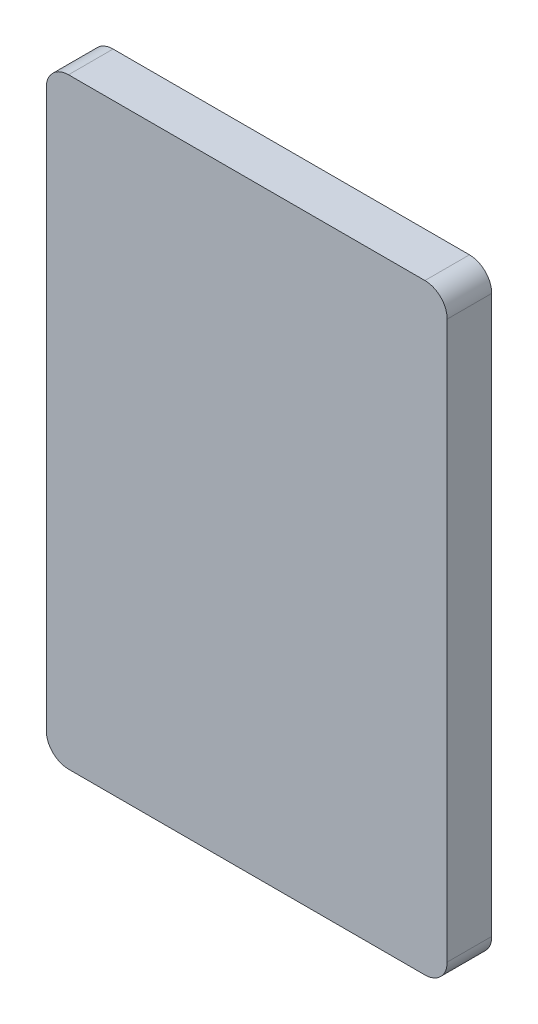
ISO-10303-21;
HEADER;
FILE_DESCRIPTION(('STEP AP214'),'2;1');
FILE_NAME('part.step','',(''),(''),'','','');
FILE_SCHEMA(('AUTOMOTIVE_DESIGN { 1 0 10303 214 1 1 1 1 }'));
ENDSEC;
DATA;
#1=APPLICATION_CONTEXT('core data for automotive mechanical design processes');
#2=APPLICATION_PROTOCOL_DEFINITION('international standard','automotive_design',2000,#1);
#3=PRODUCT_CONTEXT('',#1,'mechanical');
#4=PRODUCT('Part','Part','',(#3));
#5=PRODUCT_RELATED_PRODUCT_CATEGORY('part','',(#4));
#6=PRODUCT_DEFINITION_FORMATION('','',#4);
#7=PRODUCT_DEFINITION_CONTEXT('part definition',#1,'design');
#8=PRODUCT_DEFINITION('design','',#6,#7);
#9=PRODUCT_DEFINITION_SHAPE('','',#8);
#10=(LENGTH_UNIT() NAMED_UNIT(*) SI_UNIT(.MILLI.,.METRE.));
#11=(NAMED_UNIT(*) PLANE_ANGLE_UNIT() SI_UNIT($,.RADIAN.));
#12=(NAMED_UNIT(*) SI_UNIT($,.STERADIAN.) SOLID_ANGLE_UNIT());
#13=UNCERTAINTY_MEASURE_WITH_UNIT(LENGTH_MEASURE(1.E-05),#10,'distance_accuracy_value','');
#14=(GEOMETRIC_REPRESENTATION_CONTEXT(3) GLOBAL_UNCERTAINTY_ASSIGNED_CONTEXT((#13)) GLOBAL_UNIT_ASSIGNED_CONTEXT((#10,
#11,#12)) REPRESENTATION_CONTEXT('',''));
#15=CARTESIAN_POINT('',(0.,0.,0.));
#16=DIRECTION('',(0.,0.,1.));
#17=DIRECTION('',(1.,0.,0.));
#18=AXIS2_PLACEMENT_3D('',#15,#16,#17);
#19=CARTESIAN_POINT('',(-9.,-13.5,2.));
#20=DIRECTION('',(1.,0.,0.));
#21=DIRECTION('',(0.,0.,-1.));
#22=AXIS2_PLACEMENT_3D('',#19,#20,#21);
#23=PLANE('',#22);
#24=DIRECTION('',(0.,-1.,0.));
#25=VECTOR('',#24,1.);
#26=CARTESIAN_POINT('',(-9.,-13.5,0.));
#27=LINE('',#26,#25);
#28=CARTESIAN_POINT('',(-9.,12.5,0.));
#29=VERTEX_POINT('',#28);
#30=CARTESIAN_POINT('',(-9.,-12.5,0.));
#31=VERTEX_POINT('',#30);
#32=EDGE_CURVE('E171',#29,#31,#27,.T.);
#33=ORIENTED_EDGE('',*,*,#32,.T.);
#34=DIRECTION('',(0.,0.,-1.));
#35=VECTOR('',#34,1.);
#36=CARTESIAN_POINT('',(-9.,-12.5,2.));
#37=LINE('',#36,#35);
#38=CARTESIAN_POINT('',(-9.,-12.5,2.));
#39=VERTEX_POINT('',#38);
#40=EDGE_CURVE('E13',#31,#39,#37,.F.);
#41=ORIENTED_EDGE('',*,*,#40,.T.);
#42=DIRECTION('',(0.,-1.,0.));
#43=VECTOR('',#42,1.);
#44=CARTESIAN_POINT('',(-9.,-13.5,2.));
#45=LINE('',#44,#43);
#46=CARTESIAN_POINT('',(-9.,12.5,2.));
#47=VERTEX_POINT('',#46);
#48=EDGE_CURVE('E139',#47,#39,#45,.T.);
#49=ORIENTED_EDGE('',*,*,#48,.F.);
#50=DIRECTION('',(0.,0.,-1.));
#51=VECTOR('',#50,1.);
#52=CARTESIAN_POINT('',(-9.,12.5,2.));
#53=LINE('',#52,#51);
#54=EDGE_CURVE('E55',#47,#29,#53,.T.);
#55=ORIENTED_EDGE('',*,*,#54,.T.);
#56=EDGE_LOOP('',(#33,#41,#49,#55));
#57=FACE_BOUND('',#56,.T.);
#58=ADVANCED_FACE('F47',(#57),#23,.F.);
#59=CARTESIAN_POINT('',(9.,-13.5,2.));
#60=DIRECTION('',(0.,1.,0.));
#61=DIRECTION('',(-1.,0.,0.));
#62=AXIS2_PLACEMENT_3D('',#59,#60,#61);
#63=PLANE('',#62);
#64=DIRECTION('',(1.,0.,0.));
#65=VECTOR('',#64,1.);
#66=CARTESIAN_POINT('',(9.,-13.5,0.));
#67=LINE('',#66,#65);
#68=CARTESIAN_POINT('',(-8.,-13.5,0.));
#69=VERTEX_POINT('',#68);
#70=CARTESIAN_POINT('',(8.,-13.5,0.));
#71=VERTEX_POINT('',#70);
#72=EDGE_CURVE('E144',#69,#71,#67,.T.);
#73=ORIENTED_EDGE('',*,*,#72,.T.);
#74=DIRECTION('',(0.,0.,-1.));
#75=VECTOR('',#74,1.);
#76=CARTESIAN_POINT('',(8.,-13.5,2.));
#77=LINE('',#76,#75);
#78=CARTESIAN_POINT('',(8.,-13.5,2.));
#79=VERTEX_POINT('',#78);
#80=EDGE_CURVE('E62',#71,#79,#77,.F.);
#81=ORIENTED_EDGE('',*,*,#80,.T.);
#82=DIRECTION('',(1.,0.,0.));
#83=VECTOR('',#82,1.);
#84=CARTESIAN_POINT('',(9.,-13.5,2.));
#85=LINE('',#84,#83);
#86=CARTESIAN_POINT('',(-8.,-13.5,2.));
#87=VERTEX_POINT('',#86);
#88=EDGE_CURVE('E142',#87,#79,#85,.T.);
#89=ORIENTED_EDGE('',*,*,#88,.F.);
#90=DIRECTION('',(0.,0.,-1.));
#91=VECTOR('',#90,1.);
#92=CARTESIAN_POINT('',(-8.,-13.5,2.));
#93=LINE('',#92,#91);
#94=EDGE_CURVE('E163',#87,#69,#93,.T.);
#95=ORIENTED_EDGE('',*,*,#94,.T.);
#96=EDGE_LOOP('',(#73,#81,#89,#95));
#97=FACE_BOUND('',#96,.T.);
#98=ADVANCED_FACE('F191',(#97),#63,.F.);
#99=CARTESIAN_POINT('',(9.,-13.5,2.));
#100=DIRECTION('',(-1.,0.,0.));
#101=DIRECTION('',(0.,0.,1.));
#102=AXIS2_PLACEMENT_3D('',#99,#100,#101);
#103=PLANE('',#102);
#104=DIRECTION('',(0.,1.,0.));
#105=VECTOR('',#104,1.);
#106=CARTESIAN_POINT('',(9.,-13.5,0.));
#107=LINE('',#106,#105);
#108=CARTESIAN_POINT('',(9.,-12.5,0.));
#109=VERTEX_POINT('',#108);
#110=CARTESIAN_POINT('',(9.,12.5,0.));
#111=VERTEX_POINT('',#110);
#112=EDGE_CURVE('E140',#109,#111,#107,.T.);
#113=ORIENTED_EDGE('',*,*,#112,.T.);
#114=DIRECTION('',(0.,0.,-1.));
#115=VECTOR('',#114,1.);
#116=CARTESIAN_POINT('',(9.,12.5,2.));
#117=LINE('',#116,#115);
#118=CARTESIAN_POINT('',(9.,12.5,2.));
#119=VERTEX_POINT('',#118);
#120=EDGE_CURVE('E118',#111,#119,#117,.F.);
#121=ORIENTED_EDGE('',*,*,#120,.T.);
#122=DIRECTION('',(0.,1.,0.));
#123=VECTOR('',#122,1.);
#124=CARTESIAN_POINT('',(9.,-13.5,2.));
#125=LINE('',#124,#123);
#126=CARTESIAN_POINT('',(9.,-12.5,2.));
#127=VERTEX_POINT('',#126);
#128=EDGE_CURVE('E179',#127,#119,#125,.T.);
#129=ORIENTED_EDGE('',*,*,#128,.F.);
#130=DIRECTION('',(0.,0.,-1.));
#131=VECTOR('',#130,1.);
#132=CARTESIAN_POINT('',(9.,-12.5,2.));
#133=LINE('',#132,#131);
#134=EDGE_CURVE('E123',#127,#109,#133,.T.);
#135=ORIENTED_EDGE('',*,*,#134,.T.);
#136=EDGE_LOOP('',(#113,#121,#129,#135));
#137=FACE_BOUND('',#136,.T.);
#138=ADVANCED_FACE('F190',(#137),#103,.F.);
#139=CARTESIAN_POINT('',(9.,13.5,2.));
#140=DIRECTION('',(0.,-1.,0.));
#141=DIRECTION('',(1.,0.,0.));
#142=AXIS2_PLACEMENT_3D('',#139,#140,#141);
#143=PLANE('',#142);
#144=DIRECTION('',(-1.,0.,0.));
#145=VECTOR('',#144,1.);
#146=CARTESIAN_POINT('',(9.,13.5,2.));
#147=LINE('',#146,#145);
#148=CARTESIAN_POINT('',(8.,13.5,2.));
#149=VERTEX_POINT('',#148);
#150=CARTESIAN_POINT('',(-8.,13.5,2.));
#151=VERTEX_POINT('',#150);
#152=EDGE_CURVE('E133',#149,#151,#147,.T.);
#153=ORIENTED_EDGE('',*,*,#152,.F.);
#154=DIRECTION('',(0.,0.,-1.));
#155=VECTOR('',#154,1.);
#156=CARTESIAN_POINT('',(8.,13.5,2.));
#157=LINE('',#156,#155);
#158=CARTESIAN_POINT('',(8.,13.5,0.));
#159=VERTEX_POINT('',#158);
#160=EDGE_CURVE('E117',#149,#159,#157,.T.);
#161=ORIENTED_EDGE('',*,*,#160,.T.);
#162=DIRECTION('',(-1.,0.,0.));
#163=VECTOR('',#162,1.);
#164=CARTESIAN_POINT('',(9.,13.5,0.));
#165=LINE('',#164,#163);
#166=CARTESIAN_POINT('',(-8.,13.5,0.));
#167=VERTEX_POINT('',#166);
#168=EDGE_CURVE('E130',#159,#167,#165,.T.);
#169=ORIENTED_EDGE('',*,*,#168,.T.);
#170=DIRECTION('',(0.,0.,-1.));
#171=VECTOR('',#170,1.);
#172=CARTESIAN_POINT('',(-8.,13.5,2.));
#173=LINE('',#172,#171);
#174=EDGE_CURVE('E135',#167,#151,#173,.F.);
#175=ORIENTED_EDGE('',*,*,#174,.T.);
#176=EDGE_LOOP('',(#153,#161,#169,#175));
#177=FACE_BOUND('',#176,.T.);
#178=ADVANCED_FACE('F129',(#177),#143,.F.);
#179=CARTESIAN_POINT('',(0.,0.,2.));
#180=DIRECTION('',(0.,0.,1.));
#181=DIRECTION('',(1.,0.,0.));
#182=AXIS2_PLACEMENT_3D('',#179,#180,#181);
#183=PLANE('',#182);
#184=ORIENTED_EDGE('',*,*,#128,.T.);
#185=CARTESIAN_POINT('',(8.,12.5,2.));
#186=DIRECTION('',(0.,0.,1.));
#187=DIRECTION('',(1.,0.,0.));
#188=AXIS2_PLACEMENT_3D('',#185,#186,#187);
#189=CIRCLE('',#188,1.);
#190=EDGE_CURVE('E161',#119,#149,#189,.T.);
#191=ORIENTED_EDGE('',*,*,#190,.T.);
#192=ORIENTED_EDGE('',*,*,#152,.T.);
#193=CARTESIAN_POINT('',(-8.,12.5,2.));
#194=DIRECTION('',(0.,0.,1.));
#195=DIRECTION('',(1.,0.,0.));
#196=AXIS2_PLACEMENT_3D('',#193,#194,#195);
#197=CIRCLE('',#196,1.);
#198=EDGE_CURVE('E156',#151,#47,#197,.T.);
#199=ORIENTED_EDGE('',*,*,#198,.T.);
#200=ORIENTED_EDGE('',*,*,#48,.T.);
#201=CARTESIAN_POINT('',(-8.,-12.5,2.));
#202=DIRECTION('',(0.,0.,1.));
#203=DIRECTION('',(1.,0.,0.));
#204=AXIS2_PLACEMENT_3D('',#201,#202,#203);
#205=CIRCLE('',#204,1.);
#206=EDGE_CURVE('E69',#39,#87,#205,.T.);
#207=ORIENTED_EDGE('',*,*,#206,.T.);
#208=ORIENTED_EDGE('',*,*,#88,.T.);
#209=CARTESIAN_POINT('',(8.,-12.5,2.));
#210=DIRECTION('',(0.,0.,1.));
#211=DIRECTION('',(1.,0.,0.));
#212=AXIS2_PLACEMENT_3D('',#209,#210,#211);
#213=CIRCLE('',#212,1.);
#214=EDGE_CURVE('E159',#79,#127,#213,.T.);
#215=ORIENTED_EDGE('',*,*,#214,.T.);
#216=EDGE_LOOP('',(#184,#191,#192,#199,#200,#207,#208,#215));
#217=FACE_BOUND('',#216,.T.);
#218=ADVANCED_FACE('F183',(#217),#183,.T.);
#219=CARTESIAN_POINT('',(0.,0.,0.));
#220=DIRECTION('',(0.,0.,1.));
#221=DIRECTION('',(1.,0.,0.));
#222=AXIS2_PLACEMENT_3D('',#219,#220,#221);
#223=PLANE('',#222);
#224=ORIENTED_EDGE('',*,*,#168,.F.);
#225=CARTESIAN_POINT('',(8.,12.5,0.));
#226=DIRECTION('',(0.,0.,1.));
#227=DIRECTION('',(1.,0.,0.));
#228=AXIS2_PLACEMENT_3D('',#225,#226,#227);
#229=CIRCLE('',#228,1.);
#230=EDGE_CURVE('E113',#159,#111,#229,.F.);
#231=ORIENTED_EDGE('',*,*,#230,.T.);
#232=ORIENTED_EDGE('',*,*,#112,.F.);
#233=CARTESIAN_POINT('',(8.,-12.5,0.));
#234=DIRECTION('',(0.,0.,1.));
#235=DIRECTION('',(1.,0.,0.));
#236=AXIS2_PLACEMENT_3D('',#233,#234,#235);
#237=CIRCLE('',#236,1.);
#238=EDGE_CURVE('E124',#109,#71,#237,.F.);
#239=ORIENTED_EDGE('',*,*,#238,.T.);
#240=ORIENTED_EDGE('',*,*,#72,.F.);
#241=CARTESIAN_POINT('',(-8.,-12.5,0.));
#242=DIRECTION('',(0.,0.,1.));
#243=DIRECTION('',(1.,0.,0.));
#244=AXIS2_PLACEMENT_3D('',#241,#242,#243);
#245=CIRCLE('',#244,1.);
#246=EDGE_CURVE('E150',#69,#31,#245,.F.);
#247=ORIENTED_EDGE('',*,*,#246,.T.);
#248=ORIENTED_EDGE('',*,*,#32,.F.);
#249=CARTESIAN_POINT('',(-8.,12.5,0.));
#250=DIRECTION('',(0.,0.,1.));
#251=DIRECTION('',(1.,0.,0.));
#252=AXIS2_PLACEMENT_3D('',#249,#250,#251);
#253=CIRCLE('',#252,1.);
#254=EDGE_CURVE('E134',#29,#167,#253,.F.);
#255=ORIENTED_EDGE('',*,*,#254,.T.);
#256=EDGE_LOOP('',(#224,#231,#232,#239,#240,#247,#248,#255));
#257=FACE_BOUND('',#256,.T.);
#258=ADVANCED_FACE('F137',(#257),#223,.F.);
#259=CARTESIAN_POINT('',(8.,12.5,2.));
#260=DIRECTION('',(0.,0.,-1.));
#261=DIRECTION('',(-1.,0.,0.));
#262=AXIS2_PLACEMENT_3D('',#259,#260,#261);
#263=CYLINDRICAL_SURFACE('',#262,1.);
#264=ORIENTED_EDGE('',*,*,#190,.F.);
#265=ORIENTED_EDGE('',*,*,#120,.F.);
#266=ORIENTED_EDGE('',*,*,#230,.F.);
#267=ORIENTED_EDGE('',*,*,#160,.F.);
#268=EDGE_LOOP('',(#264,#265,#266,#267));
#269=FACE_BOUND('',#268,.T.);
#270=ADVANCED_FACE('F116',(#269),#263,.T.);
#271=CARTESIAN_POINT('',(8.,-12.5,2.));
#272=DIRECTION('',(0.,0.,-1.));
#273=DIRECTION('',(-1.,0.,0.));
#274=AXIS2_PLACEMENT_3D('',#271,#272,#273);
#275=CYLINDRICAL_SURFACE('',#274,1.);
#276=ORIENTED_EDGE('',*,*,#214,.F.);
#277=ORIENTED_EDGE('',*,*,#80,.F.);
#278=ORIENTED_EDGE('',*,*,#238,.F.);
#279=ORIENTED_EDGE('',*,*,#134,.F.);
#280=EDGE_LOOP('',(#276,#277,#278,#279));
#281=FACE_BOUND('',#280,.T.);
#282=ADVANCED_FACE('F188',(#281),#275,.T.);
#283=CARTESIAN_POINT('',(-8.,-12.5,2.));
#284=DIRECTION('',(0.,0.,-1.));
#285=DIRECTION('',(-1.,0.,0.));
#286=AXIS2_PLACEMENT_3D('',#283,#284,#285);
#287=CYLINDRICAL_SURFACE('',#286,1.);
#288=ORIENTED_EDGE('',*,*,#206,.F.);
#289=ORIENTED_EDGE('',*,*,#40,.F.);
#290=ORIENTED_EDGE('',*,*,#246,.F.);
#291=ORIENTED_EDGE('',*,*,#94,.F.);
#292=EDGE_LOOP('',(#288,#289,#290,#291));
#293=FACE_BOUND('',#292,.T.);
#294=ADVANCED_FACE('F193',(#293),#287,.T.);
#295=CARTESIAN_POINT('',(-8.,12.5,2.));
#296=DIRECTION('',(0.,0.,-1.));
#297=DIRECTION('',(-1.,0.,0.));
#298=AXIS2_PLACEMENT_3D('',#295,#296,#297);
#299=CYLINDRICAL_SURFACE('',#298,1.);
#300=ORIENTED_EDGE('',*,*,#198,.F.);
#301=ORIENTED_EDGE('',*,*,#174,.F.);
#302=ORIENTED_EDGE('',*,*,#254,.F.);
#303=ORIENTED_EDGE('',*,*,#54,.F.);
#304=EDGE_LOOP('',(#300,#301,#302,#303));
#305=FACE_BOUND('',#304,.T.);
#306=ADVANCED_FACE('F49',(#305),#299,.T.);
#307=CLOSED_SHELL('',(#58,#98,#138,#178,#218,#258,#270,#282,#294,#306));
#308=MANIFOLD_SOLID_BREP('B2',#307);
#309=ADVANCED_BREP_SHAPE_REPRESENTATION('',(#18,#308),#14);
#310=SHAPE_DEFINITION_REPRESENTATION(#9,#309);
ENDSEC;
END-ISO-10303-21;
